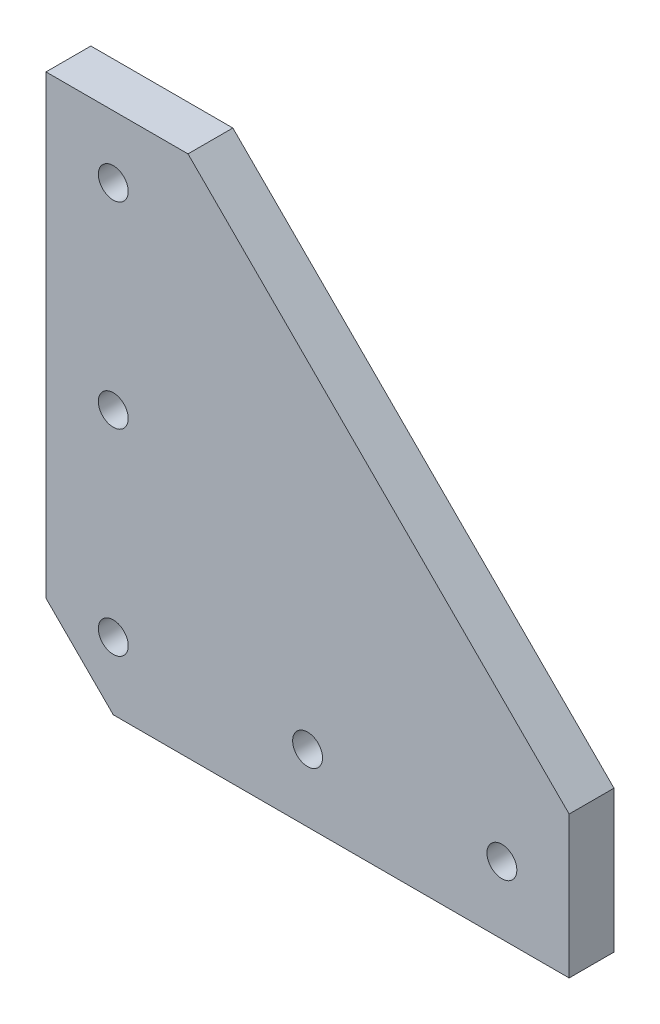
ISO-10303-21;
HEADER;
FILE_DESCRIPTION(('STEP AP214'),'2;1');
FILE_NAME('part.step','',(''),(''),'','','');
FILE_SCHEMA(('AUTOMOTIVE_DESIGN { 1 0 10303 214 1 1 1 1 }'));
ENDSEC;
DATA;
#1=APPLICATION_CONTEXT('core data for automotive mechanical design processes');
#2=APPLICATION_PROTOCOL_DEFINITION('international standard','automotive_design',2000,#1);
#3=PRODUCT_CONTEXT('',#1,'mechanical');
#4=PRODUCT('Part','Part','',(#3));
#5=PRODUCT_RELATED_PRODUCT_CATEGORY('part','',(#4));
#6=PRODUCT_DEFINITION_FORMATION('','',#4);
#7=PRODUCT_DEFINITION_CONTEXT('part definition',#1,'design');
#8=PRODUCT_DEFINITION('design','',#6,#7);
#9=PRODUCT_DEFINITION_SHAPE('','',#8);
#10=(LENGTH_UNIT() NAMED_UNIT(*) SI_UNIT(.MILLI.,.METRE.));
#11=(NAMED_UNIT(*) PLANE_ANGLE_UNIT() SI_UNIT($,.RADIAN.));
#12=(NAMED_UNIT(*) SI_UNIT($,.STERADIAN.) SOLID_ANGLE_UNIT());
#13=UNCERTAINTY_MEASURE_WITH_UNIT(LENGTH_MEASURE(1.E-05),#10,'distance_accuracy_value','');
#14=(GEOMETRIC_REPRESENTATION_CONTEXT(3) GLOBAL_UNCERTAINTY_ASSIGNED_CONTEXT((#13)) GLOBAL_UNIT_ASSIGNED_CONTEXT((#10,
#11,#12)) REPRESENTATION_CONTEXT('',''));
#15=CARTESIAN_POINT('',(0.,0.,0.));
#16=DIRECTION('',(0.,0.,1.));
#17=DIRECTION('',(1.,0.,0.));
#18=AXIS2_PLACEMENT_3D('',#15,#16,#17);
#19=CARTESIAN_POINT('',(0.,0.,6.));
#20=DIRECTION('',(0.,0.,1.));
#21=DIRECTION('',(1.,0.,0.));
#22=AXIS2_PLACEMENT_3D('',#19,#20,#21);
#23=PLANE('',#22);
#24=CARTESIAN_POINT('',(9.,61.6438375862069,6.));
#25=DIRECTION('',(0.,0.,1.));
#26=DIRECTION('',(1.,0.,0.));
#27=AXIS2_PLACEMENT_3D('',#24,#25,#26);
#28=CIRCLE('',#27,2.);
#29=CARTESIAN_POINT('',(11.,61.6438375862069,6.));
#30=VERTEX_POINT('',#29);
#31=EDGE_CURVE('E147',#30,#30,#28,.T.);
#32=ORIENTED_EDGE('',*,*,#31,.F.);
#33=EDGE_LOOP('',(#32));
#34=FACE_BOUND('',#33,.T.);
#35=CARTESIAN_POINT('',(35.0000000000003,9.,6.));
#36=DIRECTION('',(0.,0.,1.));
#37=DIRECTION('',(1.,0.,0.));
#38=AXIS2_PLACEMENT_3D('',#35,#36,#37);
#39=CIRCLE('',#38,2.);
#40=CARTESIAN_POINT('',(37.0000000000003,9.,6.));
#41=VERTEX_POINT('',#40);
#42=EDGE_CURVE('E135',#41,#41,#39,.T.);
#43=ORIENTED_EDGE('',*,*,#42,.F.);
#44=EDGE_LOOP('',(#43));
#45=FACE_BOUND('',#44,.T.);
#46=DIRECTION('',(0.,-1.,0.));
#47=VECTOR('',#46,1.);
#48=CARTESIAN_POINT('',(0.,70.,6.));
#49=LINE('',#48,#47);
#50=CARTESIAN_POINT('',(0.,70.,6.));
#51=VERTEX_POINT('',#50);
#52=CARTESIAN_POINT('',(0.,9.00000000000002,6.));
#53=VERTEX_POINT('',#52);
#54=EDGE_CURVE('E82',#51,#53,#49,.T.);
#55=ORIENTED_EDGE('',*,*,#54,.T.);
#56=DIRECTION('',(-0.707106781186546,0.707106781186549,0.));
#57=VECTOR('',#56,1.);
#58=CARTESIAN_POINT('',(4.50000000000001,4.5,6.));
#59=LINE('',#58,#57);
#60=CARTESIAN_POINT('',(8.99999999999999,0.,6.));
#61=VERTEX_POINT('',#60);
#62=EDGE_CURVE('E11',#53,#61,#59,.F.);
#63=ORIENTED_EDGE('',*,*,#62,.T.);
#64=DIRECTION('',(1.,0.,0.));
#65=VECTOR('',#64,1.);
#66=CARTESIAN_POINT('',(0.,0.,6.));
#67=LINE('',#66,#65);
#68=CARTESIAN_POINT('',(70.0000000000006,0.,6.));
#69=VERTEX_POINT('',#68);
#70=EDGE_CURVE('E90',#61,#69,#67,.T.);
#71=ORIENTED_EDGE('',*,*,#70,.T.);
#72=DIRECTION('',(0.,1.,0.));
#73=VECTOR('',#72,1.);
#74=CARTESIAN_POINT('',(70.0000000000006,0.,6.));
#75=LINE('',#74,#73);
#76=CARTESIAN_POINT('',(70.0000000000006,19.,6.));
#77=VERTEX_POINT('',#76);
#78=EDGE_CURVE('E129',#69,#77,#75,.T.);
#79=ORIENTED_EDGE('',*,*,#78,.T.);
#80=DIRECTION('',(-0.707106781186551,0.707106781186544,0.));
#81=VECTOR('',#80,1.);
#82=CARTESIAN_POINT('',(70.0000000000006,19.,6.));
#83=LINE('',#82,#81);
#84=CARTESIAN_POINT('',(19.,70.,6.));
#85=VERTEX_POINT('',#84);
#86=EDGE_CURVE('E96',#77,#85,#83,.T.);
#87=ORIENTED_EDGE('',*,*,#86,.T.);
#88=DIRECTION('',(-1.,0.,0.));
#89=VECTOR('',#88,1.);
#90=CARTESIAN_POINT('',(19.,70.,6.));
#91=LINE('',#90,#89);
#92=EDGE_CURVE('E91',#85,#51,#91,.T.);
#93=ORIENTED_EDGE('',*,*,#92,.T.);
#94=EDGE_LOOP('',(#55,#63,#71,#79,#87,#93));
#95=FACE_BOUND('',#94,.T.);
#96=CARTESIAN_POINT('',(9.,9.,6.));
#97=DIRECTION('',(0.,0.,1.));
#98=DIRECTION('',(1.,0.,0.));
#99=AXIS2_PLACEMENT_3D('',#96,#97,#98);
#100=CIRCLE('',#99,2.);
#101=CARTESIAN_POINT('',(11.,9.,6.));
#102=VERTEX_POINT('',#101);
#103=EDGE_CURVE('E127',#102,#102,#100,.T.);
#104=ORIENTED_EDGE('',*,*,#103,.F.);
#105=EDGE_LOOP('',(#104));
#106=FACE_BOUND('',#105,.T.);
#107=CARTESIAN_POINT('',(61.0000000000006,9.,6.));
#108=DIRECTION('',(0.,0.,1.));
#109=DIRECTION('',(1.,0.,0.));
#110=AXIS2_PLACEMENT_3D('',#107,#108,#109);
#111=CIRCLE('',#110,2.);
#112=CARTESIAN_POINT('',(63.0000000000006,9.,6.));
#113=VERTEX_POINT('',#112);
#114=EDGE_CURVE('E141',#113,#113,#111,.T.);
#115=ORIENTED_EDGE('',*,*,#114,.F.);
#116=EDGE_LOOP('',(#115));
#117=FACE_BOUND('',#116,.T.);
#118=CARTESIAN_POINT('',(9.,35.3219187931034,6.));
#119=DIRECTION('',(0.,0.,1.));
#120=DIRECTION('',(1.,0.,0.));
#121=AXIS2_PLACEMENT_3D('',#118,#119,#120);
#122=CIRCLE('',#121,2.);
#123=CARTESIAN_POINT('',(11.,35.3219187931034,6.));
#124=VERTEX_POINT('',#123);
#125=EDGE_CURVE('E153',#124,#124,#122,.T.);
#126=ORIENTED_EDGE('',*,*,#125,.F.);
#127=EDGE_LOOP('',(#126));
#128=FACE_BOUND('',#127,.T.);
#129=ADVANCED_FACE('F33',(#34,#45,#95,#106,#117,#128),#23,.T.);
#130=CARTESIAN_POINT('',(0.,0.,0.));
#131=DIRECTION('',(0.,0.,1.));
#132=DIRECTION('',(1.,0.,0.));
#133=AXIS2_PLACEMENT_3D('',#130,#131,#132);
#134=PLANE('',#133);
#135=DIRECTION('',(1.,0.,0.));
#136=VECTOR('',#135,1.);
#137=CARTESIAN_POINT('',(0.,0.,0.));
#138=LINE('',#137,#136);
#139=CARTESIAN_POINT('',(8.99999999999999,0.,0.));
#140=VERTEX_POINT('',#139);
#141=CARTESIAN_POINT('',(70.0000000000006,0.,0.));
#142=VERTEX_POINT('',#141);
#143=EDGE_CURVE('E122',#140,#142,#138,.T.);
#144=ORIENTED_EDGE('',*,*,#143,.F.);
#145=DIRECTION('',(0.707106781186546,-0.707106781186549,0.));
#146=VECTOR('',#145,1.);
#147=CARTESIAN_POINT('',(8.99999999999999,0.,0.));
#148=LINE('',#147,#146);
#149=CARTESIAN_POINT('',(0.,9.00000000000002,0.));
#150=VERTEX_POINT('',#149);
#151=EDGE_CURVE('E55',#140,#150,#148,.F.);
#152=ORIENTED_EDGE('',*,*,#151,.T.);
#153=DIRECTION('',(0.,-1.,0.));
#154=VECTOR('',#153,1.);
#155=CARTESIAN_POINT('',(0.,70.,0.));
#156=LINE('',#155,#154);
#157=CARTESIAN_POINT('',(0.,70.,0.));
#158=VERTEX_POINT('',#157);
#159=EDGE_CURVE('E124',#158,#150,#156,.T.);
#160=ORIENTED_EDGE('',*,*,#159,.F.);
#161=DIRECTION('',(-1.,0.,0.));
#162=VECTOR('',#161,1.);
#163=CARTESIAN_POINT('',(19.,70.,0.));
#164=LINE('',#163,#162);
#165=CARTESIAN_POINT('',(19.,70.,0.));
#166=VERTEX_POINT('',#165);
#167=EDGE_CURVE('E104',#166,#158,#164,.T.);
#168=ORIENTED_EDGE('',*,*,#167,.F.);
#169=DIRECTION('',(-0.707106781186551,0.707106781186544,0.));
#170=VECTOR('',#169,1.);
#171=CARTESIAN_POINT('',(70.0000000000006,19.,0.));
#172=LINE('',#171,#170);
#173=CARTESIAN_POINT('',(70.0000000000006,19.,0.));
#174=VERTEX_POINT('',#173);
#175=EDGE_CURVE('E100',#174,#166,#172,.T.);
#176=ORIENTED_EDGE('',*,*,#175,.F.);
#177=DIRECTION('',(0.,1.,0.));
#178=VECTOR('',#177,1.);
#179=CARTESIAN_POINT('',(70.0000000000006,0.,0.));
#180=LINE('',#179,#178);
#181=EDGE_CURVE('E120',#142,#174,#180,.T.);
#182=ORIENTED_EDGE('',*,*,#181,.F.);
#183=EDGE_LOOP('',(#144,#152,#160,#168,#176,#182));
#184=FACE_BOUND('',#183,.T.);
#185=CARTESIAN_POINT('',(9.,9.,0.));
#186=DIRECTION('',(0.,0.,1.));
#187=DIRECTION('',(1.,0.,0.));
#188=AXIS2_PLACEMENT_3D('',#185,#186,#187);
#189=CIRCLE('',#188,2.);
#190=CARTESIAN_POINT('',(11.,9.,0.));
#191=VERTEX_POINT('',#190);
#192=EDGE_CURVE('E132',#191,#191,#189,.T.);
#193=ORIENTED_EDGE('',*,*,#192,.T.);
#194=EDGE_LOOP('',(#193));
#195=FACE_BOUND('',#194,.T.);
#196=CARTESIAN_POINT('',(35.0000000000003,9.,0.));
#197=DIRECTION('',(0.,0.,1.));
#198=DIRECTION('',(1.,0.,0.));
#199=AXIS2_PLACEMENT_3D('',#196,#197,#198);
#200=CIRCLE('',#199,2.);
#201=CARTESIAN_POINT('',(37.0000000000003,9.,0.));
#202=VERTEX_POINT('',#201);
#203=EDGE_CURVE('E138',#202,#202,#200,.T.);
#204=ORIENTED_EDGE('',*,*,#203,.T.);
#205=EDGE_LOOP('',(#204));
#206=FACE_BOUND('',#205,.T.);
#207=CARTESIAN_POINT('',(61.0000000000006,9.,0.));
#208=DIRECTION('',(0.,0.,1.));
#209=DIRECTION('',(1.,0.,0.));
#210=AXIS2_PLACEMENT_3D('',#207,#208,#209);
#211=CIRCLE('',#210,2.);
#212=CARTESIAN_POINT('',(63.0000000000006,9.,0.));
#213=VERTEX_POINT('',#212);
#214=EDGE_CURVE('E144',#213,#213,#211,.T.);
#215=ORIENTED_EDGE('',*,*,#214,.T.);
#216=EDGE_LOOP('',(#215));
#217=FACE_BOUND('',#216,.T.);
#218=CARTESIAN_POINT('',(9.,61.6438375862069,0.));
#219=DIRECTION('',(0.,0.,1.));
#220=DIRECTION('',(1.,0.,0.));
#221=AXIS2_PLACEMENT_3D('',#218,#219,#220);
#222=CIRCLE('',#221,2.);
#223=CARTESIAN_POINT('',(11.,61.6438375862069,0.));
#224=VERTEX_POINT('',#223);
#225=EDGE_CURVE('E150',#224,#224,#222,.T.);
#226=ORIENTED_EDGE('',*,*,#225,.T.);
#227=EDGE_LOOP('',(#226));
#228=FACE_BOUND('',#227,.T.);
#229=CARTESIAN_POINT('',(9.,35.3219187931034,0.));
#230=DIRECTION('',(0.,0.,1.));
#231=DIRECTION('',(1.,0.,0.));
#232=AXIS2_PLACEMENT_3D('',#229,#230,#231);
#233=CIRCLE('',#232,2.);
#234=CARTESIAN_POINT('',(11.,35.3219187931034,0.));
#235=VERTEX_POINT('',#234);
#236=EDGE_CURVE('E156',#235,#235,#233,.T.);
#237=ORIENTED_EDGE('',*,*,#236,.T.);
#238=EDGE_LOOP('',(#237));
#239=FACE_BOUND('',#238,.T.);
#240=ADVANCED_FACE('F166',(#184,#195,#206,#217,#228,#239),#134,.F.);
#241=CARTESIAN_POINT('',(19.,70.,6.));
#242=DIRECTION('',(0.,-1.,0.));
#243=DIRECTION('',(0.,0.,-1.));
#244=AXIS2_PLACEMENT_3D('',#241,#242,#243);
#245=PLANE('',#244);
#246=ORIENTED_EDGE('',*,*,#167,.T.);
#247=DIRECTION('',(0.,0.,-1.));
#248=VECTOR('',#247,1.);
#249=CARTESIAN_POINT('',(0.,70.,6.));
#250=LINE('',#249,#248);
#251=EDGE_CURVE('E86',#51,#158,#250,.T.);
#252=ORIENTED_EDGE('',*,*,#251,.F.);
#253=ORIENTED_EDGE('',*,*,#92,.F.);
#254=DIRECTION('',(0.,0.,-1.));
#255=VECTOR('',#254,1.);
#256=CARTESIAN_POINT('',(19.,70.,6.));
#257=LINE('',#256,#255);
#258=EDGE_CURVE('E117',#85,#166,#257,.T.);
#259=ORIENTED_EDGE('',*,*,#258,.T.);
#260=EDGE_LOOP('',(#246,#252,#253,#259));
#261=FACE_BOUND('',#260,.T.);
#262=ADVANCED_FACE('F102',(#261),#245,.F.);
#263=CARTESIAN_POINT('',(0.,70.,6.));
#264=DIRECTION('',(1.,0.,0.));
#265=DIRECTION('',(0.,1.,0.));
#266=AXIS2_PLACEMENT_3D('',#263,#264,#265);
#267=PLANE('',#266);
#268=ORIENTED_EDGE('',*,*,#159,.T.);
#269=DIRECTION('',(0.,0.,1.));
#270=VECTOR('',#269,1.);
#271=CARTESIAN_POINT('',(0.,9.00000000000002,6.));
#272=LINE('',#271,#270);
#273=EDGE_CURVE('E41',#150,#53,#272,.T.);
#274=ORIENTED_EDGE('',*,*,#273,.T.);
#275=ORIENTED_EDGE('',*,*,#54,.F.);
#276=ORIENTED_EDGE('',*,*,#251,.T.);
#277=EDGE_LOOP('',(#268,#274,#275,#276));
#278=FACE_BOUND('',#277,.T.);
#279=ADVANCED_FACE('F84',(#278),#267,.F.);
#280=CARTESIAN_POINT('',(0.,0.,6.));
#281=DIRECTION('',(0.,1.,0.));
#282=DIRECTION('',(0.,0.,1.));
#283=AXIS2_PLACEMENT_3D('',#280,#281,#282);
#284=PLANE('',#283);
#285=ORIENTED_EDGE('',*,*,#70,.F.);
#286=DIRECTION('',(0.,0.,-1.));
#287=VECTOR('',#286,1.);
#288=CARTESIAN_POINT('',(8.99999999999999,0.,6.));
#289=LINE('',#288,#287);
#290=EDGE_CURVE('E105',#61,#140,#289,.T.);
#291=ORIENTED_EDGE('',*,*,#290,.T.);
#292=ORIENTED_EDGE('',*,*,#143,.T.);
#293=DIRECTION('',(0.,0.,-1.));
#294=VECTOR('',#293,1.);
#295=CARTESIAN_POINT('',(70.0000000000006,0.,6.));
#296=LINE('',#295,#294);
#297=EDGE_CURVE('E106',#69,#142,#296,.T.);
#298=ORIENTED_EDGE('',*,*,#297,.F.);
#299=EDGE_LOOP('',(#285,#291,#292,#298));
#300=FACE_BOUND('',#299,.T.);
#301=ADVANCED_FACE('F186',(#300),#284,.F.);
#302=CARTESIAN_POINT('',(70.0000000000006,0.,6.));
#303=DIRECTION('',(-1.,0.,0.));
#304=DIRECTION('',(0.,-1.,0.));
#305=AXIS2_PLACEMENT_3D('',#302,#303,#304);
#306=PLANE('',#305);
#307=ORIENTED_EDGE('',*,*,#181,.T.);
#308=DIRECTION('',(0.,0.,-1.));
#309=VECTOR('',#308,1.);
#310=CARTESIAN_POINT('',(70.0000000000006,19.,6.));
#311=LINE('',#310,#309);
#312=EDGE_CURVE('E111',#77,#174,#311,.T.);
#313=ORIENTED_EDGE('',*,*,#312,.F.);
#314=ORIENTED_EDGE('',*,*,#78,.F.);
#315=ORIENTED_EDGE('',*,*,#297,.T.);
#316=EDGE_LOOP('',(#307,#313,#314,#315));
#317=FACE_BOUND('',#316,.T.);
#318=ADVANCED_FACE('F182',(#317),#306,.F.);
#319=CARTESIAN_POINT('',(70.0000000000006,19.,6.));
#320=DIRECTION('',(-0.707106781186544,-0.707106781186551,0.));
#321=DIRECTION('',(0.707106781186551,-0.707106781186544,0.));
#322=AXIS2_PLACEMENT_3D('',#319,#320,#321);
#323=PLANE('',#322);
#324=ORIENTED_EDGE('',*,*,#175,.T.);
#325=ORIENTED_EDGE('',*,*,#258,.F.);
#326=ORIENTED_EDGE('',*,*,#86,.F.);
#327=ORIENTED_EDGE('',*,*,#312,.T.);
#328=EDGE_LOOP('',(#324,#325,#326,#327));
#329=FACE_BOUND('',#328,.T.);
#330=ADVANCED_FACE('F179',(#329),#323,.F.);
#331=CARTESIAN_POINT('',(9.,9.,6.));
#332=DIRECTION('',(0.,0.,-1.));
#333=DIRECTION('',(-1.,0.,0.));
#334=AXIS2_PLACEMENT_3D('',#331,#332,#333);
#335=CYLINDRICAL_SURFACE('',#334,2.);
#336=ORIENTED_EDGE('',*,*,#103,.T.);
#337=EDGE_LOOP('',(#336));
#338=FACE_BOUND('',#337,.T.);
#339=ORIENTED_EDGE('',*,*,#192,.F.);
#340=EDGE_LOOP('',(#339));
#341=FACE_BOUND('',#340,.T.);
#342=ADVANCED_FACE('F176',(#338,#341),#335,.F.);
#343=CARTESIAN_POINT('',(35.0000000000003,9.,6.));
#344=DIRECTION('',(0.,0.,-1.));
#345=DIRECTION('',(-1.,0.,0.));
#346=AXIS2_PLACEMENT_3D('',#343,#344,#345);
#347=CYLINDRICAL_SURFACE('',#346,2.);
#348=ORIENTED_EDGE('',*,*,#42,.T.);
#349=EDGE_LOOP('',(#348));
#350=FACE_BOUND('',#349,.T.);
#351=ORIENTED_EDGE('',*,*,#203,.F.);
#352=EDGE_LOOP('',(#351));
#353=FACE_BOUND('',#352,.T.);
#354=ADVANCED_FACE('F220',(#350,#353),#347,.F.);
#355=CARTESIAN_POINT('',(61.0000000000006,9.,6.));
#356=DIRECTION('',(0.,0.,-1.));
#357=DIRECTION('',(-1.,0.,0.));
#358=AXIS2_PLACEMENT_3D('',#355,#356,#357);
#359=CYLINDRICAL_SURFACE('',#358,2.);
#360=ORIENTED_EDGE('',*,*,#114,.T.);
#361=EDGE_LOOP('',(#360));
#362=FACE_BOUND('',#361,.T.);
#363=ORIENTED_EDGE('',*,*,#214,.F.);
#364=EDGE_LOOP('',(#363));
#365=FACE_BOUND('',#364,.T.);
#366=ADVANCED_FACE('F227',(#362,#365),#359,.F.);
#367=CARTESIAN_POINT('',(9.,61.6438375862069,6.));
#368=DIRECTION('',(0.,0.,-1.));
#369=DIRECTION('',(-1.,0.,0.));
#370=AXIS2_PLACEMENT_3D('',#367,#368,#369);
#371=CYLINDRICAL_SURFACE('',#370,2.);
#372=ORIENTED_EDGE('',*,*,#31,.T.);
#373=EDGE_LOOP('',(#372));
#374=FACE_BOUND('',#373,.T.);
#375=ORIENTED_EDGE('',*,*,#225,.F.);
#376=EDGE_LOOP('',(#375));
#377=FACE_BOUND('',#376,.T.);
#378=ADVANCED_FACE('F234',(#374,#377),#371,.F.);
#379=CARTESIAN_POINT('',(9.,35.3219187931034,6.));
#380=DIRECTION('',(0.,0.,-1.));
#381=DIRECTION('',(-1.,0.,0.));
#382=AXIS2_PLACEMENT_3D('',#379,#380,#381);
#383=CYLINDRICAL_SURFACE('',#382,2.);
#384=ORIENTED_EDGE('',*,*,#125,.T.);
#385=EDGE_LOOP('',(#384));
#386=FACE_BOUND('',#385,.T.);
#387=ORIENTED_EDGE('',*,*,#236,.F.);
#388=EDGE_LOOP('',(#387));
#389=FACE_BOUND('',#388,.T.);
#390=ADVANCED_FACE('F162',(#386,#389),#383,.F.);
#391=CARTESIAN_POINT('',(8.99999999999999,0.,6.));
#392=DIRECTION('',(0.707106781186549,0.707106781186546,0.));
#393=DIRECTION('',(0.,0.,-1.));
#394=AXIS2_PLACEMENT_3D('',#391,#392,#393);
#395=PLANE('',#394);
#396=ORIENTED_EDGE('',*,*,#62,.F.);
#397=ORIENTED_EDGE('',*,*,#273,.F.);
#398=ORIENTED_EDGE('',*,*,#151,.F.);
#399=ORIENTED_EDGE('',*,*,#290,.F.);
#400=EDGE_LOOP('',(#396,#397,#398,#399));
#401=FACE_BOUND('',#400,.T.);
#402=ADVANCED_FACE('F35',(#401),#395,.F.);
#403=CLOSED_SHELL('',(#129,#240,#262,#279,#301,#318,#330,#342,#354,#366,#378,#390,#402));
#404=MANIFOLD_SOLID_BREP('B2',#403);
#405=ADVANCED_BREP_SHAPE_REPRESENTATION('',(#18,#404),#14);
#406=SHAPE_DEFINITION_REPRESENTATION(#9,#405);
ENDSEC;
END-ISO-10303-21;
